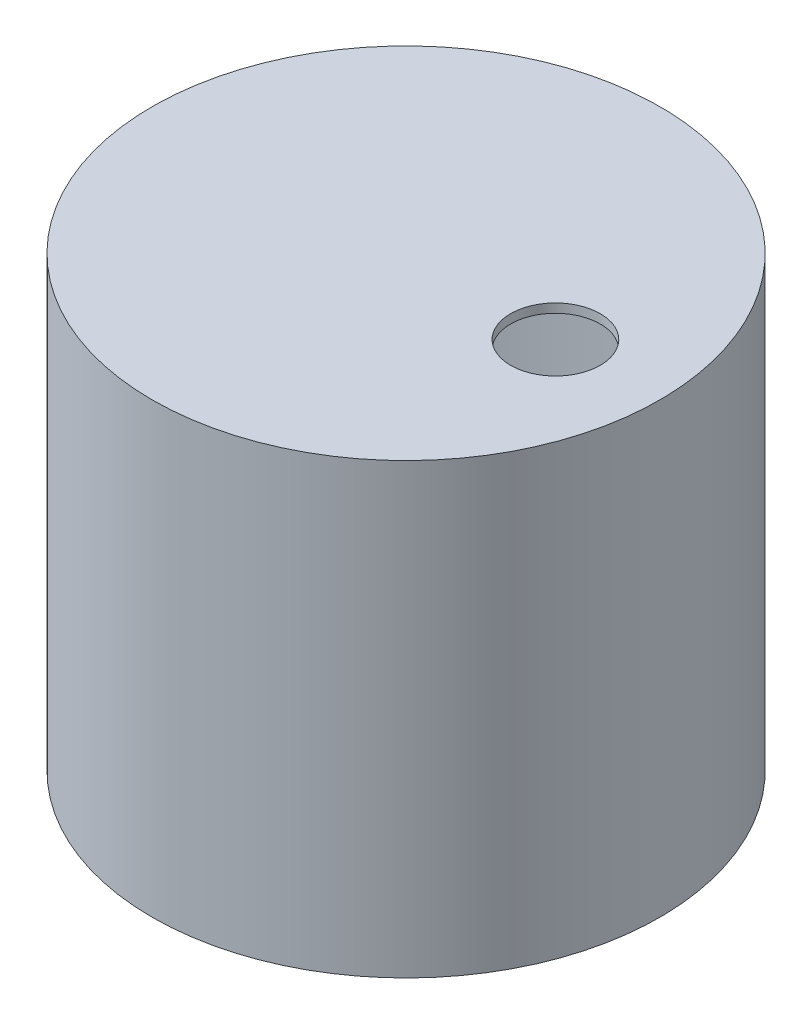
ISO-10303-21;
HEADER;
FILE_DESCRIPTION(('STEP AP214'),'2;1');
FILE_NAME('part.step','',(''),(''),'','','');
FILE_SCHEMA(('AUTOMOTIVE_DESIGN { 1 0 10303 214 1 1 1 1 }'));
ENDSEC;
DATA;
#1=APPLICATION_CONTEXT('core data for automotive mechanical design processes');
#2=APPLICATION_PROTOCOL_DEFINITION('international standard','automotive_design',2000,#1);
#3=PRODUCT_CONTEXT('',#1,'mechanical');
#4=PRODUCT('Part','Part','',(#3));
#5=PRODUCT_RELATED_PRODUCT_CATEGORY('part','',(#4));
#6=PRODUCT_DEFINITION_FORMATION('','',#4);
#7=PRODUCT_DEFINITION_CONTEXT('part definition',#1,'design');
#8=PRODUCT_DEFINITION('design','',#6,#7);
#9=PRODUCT_DEFINITION_SHAPE('','',#8);
#10=(LENGTH_UNIT() NAMED_UNIT(*) SI_UNIT(.MILLI.,.METRE.));
#11=(NAMED_UNIT(*) PLANE_ANGLE_UNIT() SI_UNIT($,.RADIAN.));
#12=(NAMED_UNIT(*) SI_UNIT($,.STERADIAN.) SOLID_ANGLE_UNIT());
#13=UNCERTAINTY_MEASURE_WITH_UNIT(LENGTH_MEASURE(1.E-05),#10,'distance_accuracy_value','');
#14=(GEOMETRIC_REPRESENTATION_CONTEXT(3) GLOBAL_UNCERTAINTY_ASSIGNED_CONTEXT((#13)) GLOBAL_UNIT_ASSIGNED_CONTEXT((#10,
#11,#12)) REPRESENTATION_CONTEXT('',''));
#15=CARTESIAN_POINT('',(0.,0.,0.));
#16=DIRECTION('',(0.,0.,1.));
#17=DIRECTION('',(1.,0.,0.));
#18=AXIS2_PLACEMENT_3D('',#15,#16,#17);
#19=CARTESIAN_POINT('',(0.,300.,0.));
#20=DIRECTION('',(0.,-1.,0.));
#21=DIRECTION('',(0.,0.,-1.));
#22=AXIS2_PLACEMENT_3D('',#19,#20,#21);
#23=CYLINDRICAL_SURFACE('',#22,166.);
#24=CARTESIAN_POINT('',(0.,46.,0.));
#25=DIRECTION('',(0.,1.,0.));
#26=DIRECTION('',(0.,0.,1.));
#27=AXIS2_PLACEMENT_3D('',#24,#25,#26);
#28=CIRCLE('',#27,166.);
#29=CARTESIAN_POINT('',(0.,46.,166.));
#30=VERTEX_POINT('',#29);
#31=EDGE_CURVE('E10',#30,#30,#28,.T.);
#32=ORIENTED_EDGE('',*,*,#31,.F.);
#33=EDGE_LOOP('',(#32));
#34=FACE_BOUND('',#33,.T.);
#35=CARTESIAN_POINT('',(0.,294.,0.));
#36=DIRECTION('',(0.,1.,0.));
#37=DIRECTION('',(0.,0.,1.));
#38=AXIS2_PLACEMENT_3D('',#35,#36,#37);
#39=CIRCLE('',#38,166.);
#40=CARTESIAN_POINT('',(0.,294.,166.));
#41=VERTEX_POINT('',#40);
#42=EDGE_CURVE('E44',#41,#41,#39,.T.);
#43=ORIENTED_EDGE('',*,*,#42,.T.);
#44=EDGE_LOOP('',(#43));
#45=FACE_BOUND('',#44,.T.);
#46=ADVANCED_FACE('F41',(#34,#45),#23,.F.);
#47=CARTESIAN_POINT('',(0.,0.,0.));
#48=DIRECTION('',(0.,1.,0.));
#49=DIRECTION('',(0.,0.,1.));
#50=AXIS2_PLACEMENT_3D('',#47,#48,#49);
#51=CIRCLE('',#50,166.);
#52=CARTESIAN_POINT('',(0.,0.,166.));
#53=VERTEX_POINT('',#52);
#54=EDGE_CURVE('E56',#53,#53,#51,.T.);
#55=ORIENTED_EDGE('',*,*,#54,.F.);
#56=EDGE_LOOP('',(#55));
#57=FACE_BOUND('',#56,.T.);
#58=CARTESIAN_POINT('',(0.,40.,0.));
#59=DIRECTION('',(0.,1.,0.));
#60=DIRECTION('',(0.,0.,1.));
#61=AXIS2_PLACEMENT_3D('',#58,#59,#60);
#62=CIRCLE('',#61,166.);
#63=CARTESIAN_POINT('',(0.,40.,166.));
#64=VERTEX_POINT('',#63);
#65=EDGE_CURVE('E57',#64,#64,#62,.T.);
#66=ORIENTED_EDGE('',*,*,#65,.T.);
#67=EDGE_LOOP('',(#66));
#68=FACE_BOUND('',#67,.T.);
#69=ADVANCED_FACE('F100',(#57,#68),#23,.F.);
#70=CARTESIAN_POINT('',(0.,300.,0.));
#71=DIRECTION('',(0.,1.,0.));
#72=DIRECTION('',(0.,0.,1.));
#73=AXIS2_PLACEMENT_3D('',#70,#71,#72);
#74=PLANE('',#73);
#75=CARTESIAN_POINT('',(0.,300.,0.));
#76=DIRECTION('',(0.,1.,0.));
#77=DIRECTION('',(0.,0.,1.));
#78=AXIS2_PLACEMENT_3D('',#75,#76,#77);
#79=CIRCLE('',#78,170.);
#80=CARTESIAN_POINT('',(0.,300.,170.));
#81=VERTEX_POINT('',#80);
#82=EDGE_CURVE('E47',#81,#81,#79,.T.);
#83=ORIENTED_EDGE('',*,*,#82,.T.);
#84=EDGE_LOOP('',(#83));
#85=FACE_BOUND('',#84,.T.);
#86=CARTESIAN_POINT('',(100.,300.,0.));
#87=DIRECTION('',(0.,1.,0.));
#88=DIRECTION('',(0.,0.,1.));
#89=AXIS2_PLACEMENT_3D('',#86,#87,#88);
#90=CIRCLE('',#89,30.);
#91=CARTESIAN_POINT('',(100.,300.,30.));
#92=VERTEX_POINT('',#91);
#93=EDGE_CURVE('E71',#92,#92,#90,.T.);
#94=ORIENTED_EDGE('',*,*,#93,.F.);
#95=EDGE_LOOP('',(#94));
#96=FACE_BOUND('',#95,.T.);
#97=ADVANCED_FACE('F102',(#85,#96),#74,.T.);
#98=CARTESIAN_POINT('',(0.,0.,0.));
#99=DIRECTION('',(0.,1.,0.));
#100=DIRECTION('',(0.,0.,1.));
#101=AXIS2_PLACEMENT_3D('',#98,#99,#100);
#102=PLANE('',#101);
#103=CARTESIAN_POINT('',(0.,0.,0.));
#104=DIRECTION('',(0.,1.,0.));
#105=DIRECTION('',(0.,0.,1.));
#106=AXIS2_PLACEMENT_3D('',#103,#104,#105);
#107=CIRCLE('',#106,170.);
#108=CARTESIAN_POINT('',(0.,0.,170.));
#109=VERTEX_POINT('',#108);
#110=EDGE_CURVE('E52',#109,#109,#107,.T.);
#111=ORIENTED_EDGE('',*,*,#110,.F.);
#112=EDGE_LOOP('',(#111));
#113=FACE_BOUND('',#112,.T.);
#114=ORIENTED_EDGE('',*,*,#54,.T.);
#115=EDGE_LOOP('',(#114));
#116=FACE_BOUND('',#115,.T.);
#117=ADVANCED_FACE('F108',(#113,#116),#102,.F.);
#118=CARTESIAN_POINT('',(0.,300.,0.));
#119=DIRECTION('',(0.,-1.,0.));
#120=DIRECTION('',(0.,0.,-1.));
#121=AXIS2_PLACEMENT_3D('',#118,#119,#120);
#122=CYLINDRICAL_SURFACE('',#121,170.);
#123=ORIENTED_EDGE('',*,*,#82,.F.);
#124=EDGE_LOOP('',(#123));
#125=FACE_BOUND('',#124,.T.);
#126=ORIENTED_EDGE('',*,*,#110,.T.);
#127=EDGE_LOOP('',(#126));
#128=FACE_BOUND('',#127,.T.);
#129=ADVANCED_FACE('F43',(#125,#128),#122,.T.);
#130=CARTESIAN_POINT('',(0.,46.,0.));
#131=DIRECTION('',(0.,1.,0.));
#132=DIRECTION('',(0.,0.,1.));
#133=AXIS2_PLACEMENT_3D('',#130,#131,#132);
#134=PLANE('',#133);
#135=CARTESIAN_POINT('',(0.,46.,0.));
#136=DIRECTION('',(0.,1.,0.));
#137=DIRECTION('',(0.,0.,1.));
#138=AXIS2_PLACEMENT_3D('',#135,#136,#137);
#139=CIRCLE('',#138,10.);
#140=CARTESIAN_POINT('',(0.,46.,10.));
#141=VERTEX_POINT('',#140);
#142=EDGE_CURVE('E58',#141,#141,#139,.T.);
#143=ORIENTED_EDGE('',*,*,#142,.F.);
#144=EDGE_LOOP('',(#143));
#145=FACE_BOUND('',#144,.T.);
#146=ORIENTED_EDGE('',*,*,#31,.T.);
#147=EDGE_LOOP('',(#146));
#148=FACE_BOUND('',#147,.T.);
#149=ADVANCED_FACE('F113',(#145,#148),#134,.T.);
#150=CARTESIAN_POINT('',(0.,40.,0.));
#151=DIRECTION('',(0.,1.,0.));
#152=DIRECTION('',(0.,0.,1.));
#153=AXIS2_PLACEMENT_3D('',#150,#151,#152);
#154=PLANE('',#153);
#155=CARTESIAN_POINT('',(0.,40.,0.));
#156=DIRECTION('',(0.,1.,0.));
#157=DIRECTION('',(0.,0.,1.));
#158=AXIS2_PLACEMENT_3D('',#155,#156,#157);
#159=CIRCLE('',#158,10.);
#160=CARTESIAN_POINT('',(0.,40.,10.));
#161=VERTEX_POINT('',#160);
#162=EDGE_CURVE('E62',#161,#161,#159,.T.);
#163=ORIENTED_EDGE('',*,*,#162,.T.);
#164=EDGE_LOOP('',(#163));
#165=FACE_BOUND('',#164,.T.);
#166=ORIENTED_EDGE('',*,*,#65,.F.);
#167=EDGE_LOOP('',(#166));
#168=FACE_BOUND('',#167,.T.);
#169=ADVANCED_FACE('F91',(#165,#168),#154,.F.);
#170=CARTESIAN_POINT('',(0.,46.,0.));
#171=DIRECTION('',(0.,-1.,0.));
#172=DIRECTION('',(0.,0.,-1.));
#173=AXIS2_PLACEMENT_3D('',#170,#171,#172);
#174=CYLINDRICAL_SURFACE('',#173,10.);
#175=ORIENTED_EDGE('',*,*,#142,.T.);
#176=EDGE_LOOP('',(#175));
#177=FACE_BOUND('',#176,.T.);
#178=ORIENTED_EDGE('',*,*,#162,.F.);
#179=EDGE_LOOP('',(#178));
#180=FACE_BOUND('',#179,.T.);
#181=ADVANCED_FACE('F81',(#177,#180),#174,.F.);
#182=CARTESIAN_POINT('',(0.,294.,0.));
#183=DIRECTION('',(0.,1.,0.));
#184=DIRECTION('',(0.,0.,1.));
#185=AXIS2_PLACEMENT_3D('',#182,#183,#184);
#186=PLANE('',#185);
#187=CARTESIAN_POINT('',(100.,294.,0.));
#188=DIRECTION('',(0.,1.,0.));
#189=DIRECTION('',(0.,0.,1.));
#190=AXIS2_PLACEMENT_3D('',#187,#188,#189);
#191=CIRCLE('',#190,30.);
#192=CARTESIAN_POINT('',(100.,294.,30.));
#193=VERTEX_POINT('',#192);
#194=EDGE_CURVE('E68',#193,#193,#191,.T.);
#195=ORIENTED_EDGE('',*,*,#194,.T.);
#196=EDGE_LOOP('',(#195));
#197=FACE_BOUND('',#196,.T.);
#198=ORIENTED_EDGE('',*,*,#42,.F.);
#199=EDGE_LOOP('',(#198));
#200=FACE_BOUND('',#199,.T.);
#201=ADVANCED_FACE('F82',(#197,#200),#186,.F.);
#202=CARTESIAN_POINT('',(100.,300.,0.));
#203=DIRECTION('',(0.,-1.,0.));
#204=DIRECTION('',(0.,0.,-1.));
#205=AXIS2_PLACEMENT_3D('',#202,#203,#204);
#206=CYLINDRICAL_SURFACE('',#205,30.);
#207=ORIENTED_EDGE('',*,*,#93,.T.);
#208=EDGE_LOOP('',(#207));
#209=FACE_BOUND('',#208,.T.);
#210=ORIENTED_EDGE('',*,*,#194,.F.);
#211=EDGE_LOOP('',(#210));
#212=FACE_BOUND('',#211,.T.);
#213=ADVANCED_FACE('F85',(#209,#212),#206,.F.);
#214=CLOSED_SHELL('',(#46,#69,#97,#117,#129,#149,#169,#181,#201,#213));
#215=MANIFOLD_SOLID_BREP('B2',#214);
#216=ADVANCED_BREP_SHAPE_REPRESENTATION('',(#18,#215),#14);
#217=SHAPE_DEFINITION_REPRESENTATION(#9,#216);
ENDSEC;
END-ISO-10303-21;
